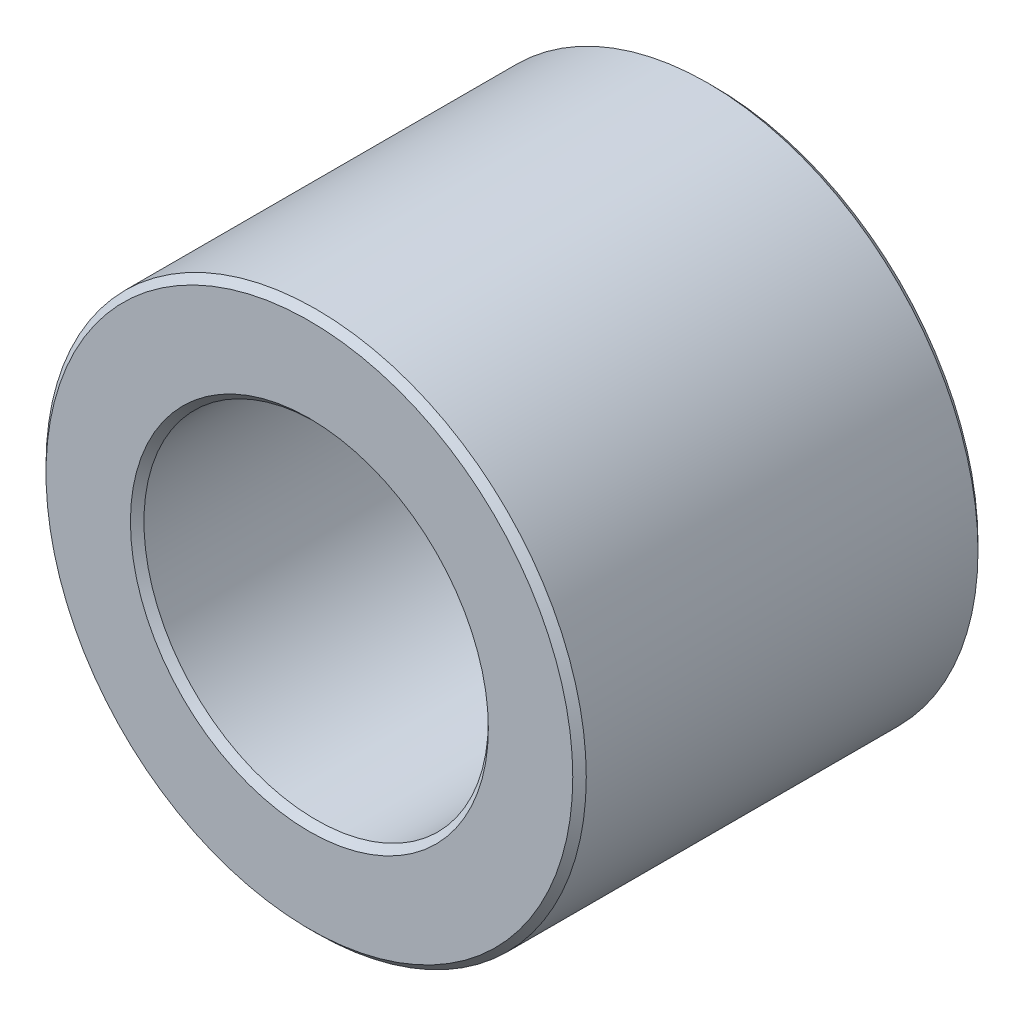
ISO-10303-21;
HEADER;
FILE_DESCRIPTION(('STEP AP214'),'2;1');
FILE_NAME('part.step','',(''),(''),'','','');
FILE_SCHEMA(('AUTOMOTIVE_DESIGN { 1 0 10303 214 1 1 1 1 }'));
ENDSEC;
DATA;
#1=APPLICATION_CONTEXT('core data for automotive mechanical design processes');
#2=APPLICATION_PROTOCOL_DEFINITION('international standard','automotive_design',2000,#1);
#3=PRODUCT_CONTEXT('',#1,'mechanical');
#4=PRODUCT('Part','Part','',(#3));
#5=PRODUCT_RELATED_PRODUCT_CATEGORY('part','',(#4));
#6=PRODUCT_DEFINITION_FORMATION('','',#4);
#7=PRODUCT_DEFINITION_CONTEXT('part definition',#1,'design');
#8=PRODUCT_DEFINITION('design','',#6,#7);
#9=PRODUCT_DEFINITION_SHAPE('','',#8);
#10=(LENGTH_UNIT() NAMED_UNIT(*) SI_UNIT(.MILLI.,.METRE.));
#11=(NAMED_UNIT(*) PLANE_ANGLE_UNIT() SI_UNIT($,.RADIAN.));
#12=(NAMED_UNIT(*) SI_UNIT($,.STERADIAN.) SOLID_ANGLE_UNIT());
#13=UNCERTAINTY_MEASURE_WITH_UNIT(LENGTH_MEASURE(1.E-05),#10,'distance_accuracy_value','');
#14=(GEOMETRIC_REPRESENTATION_CONTEXT(3) GLOBAL_UNCERTAINTY_ASSIGNED_CONTEXT((#13)) GLOBAL_UNIT_ASSIGNED_CONTEXT((#10,
#11,#12)) REPRESENTATION_CONTEXT('',''));
#15=CARTESIAN_POINT('',(0.,0.,0.));
#16=DIRECTION('',(0.,0.,1.));
#17=DIRECTION('',(1.,0.,0.));
#18=AXIS2_PLACEMENT_3D('',#15,#16,#17);
#19=CARTESIAN_POINT('',(0.,0.,6.));
#20=DIRECTION('',(0.,0.,1.));
#21=DIRECTION('',(1.,0.,0.));
#22=AXIS2_PLACEMENT_3D('',#19,#20,#21);
#23=PLANE('',#22);
#24=CARTESIAN_POINT('',(0.,0.,6.));
#25=DIRECTION('',(0.,0.,1.));
#26=DIRECTION('',(1.,0.,0.));
#27=AXIS2_PLACEMENT_3D('',#24,#25,#26);
#28=CIRCLE('',#27,2.65);
#29=CARTESIAN_POINT('',(2.65,0.,6.));
#30=VERTEX_POINT('',#29);
#31=EDGE_CURVE('E10',#30,#30,#28,.F.);
#32=ORIENTED_EDGE('',*,*,#31,.T.);
#33=EDGE_LOOP('',(#32));
#34=FACE_BOUND('',#33,.T.);
#35=CARTESIAN_POINT('',(0.,0.,6.));
#36=DIRECTION('',(0.,0.,1.));
#37=DIRECTION('',(1.,0.,0.));
#38=AXIS2_PLACEMENT_3D('',#35,#36,#37);
#39=CIRCLE('',#38,3.9);
#40=CARTESIAN_POINT('',(3.9,0.,6.));
#41=VERTEX_POINT('',#40);
#42=EDGE_CURVE('E39',#41,#41,#39,.T.);
#43=ORIENTED_EDGE('',*,*,#42,.T.);
#44=EDGE_LOOP('',(#43));
#45=FACE_BOUND('',#44,.T.);
#46=ADVANCED_FACE('F32',(#34,#45),#23,.T.);
#47=CARTESIAN_POINT('',(0.,0.,0.));
#48=DIRECTION('',(0.,0.,1.));
#49=DIRECTION('',(1.,0.,0.));
#50=AXIS2_PLACEMENT_3D('',#47,#48,#49);
#51=PLANE('',#50);
#52=CARTESIAN_POINT('',(0.,0.,0.));
#53=DIRECTION('',(0.,0.,1.));
#54=DIRECTION('',(1.,0.,0.));
#55=AXIS2_PLACEMENT_3D('',#52,#53,#54);
#56=CIRCLE('',#55,2.65);
#57=CARTESIAN_POINT('',(2.65,0.,0.));
#58=VERTEX_POINT('',#57);
#59=EDGE_CURVE('E58',#58,#58,#56,.T.);
#60=ORIENTED_EDGE('',*,*,#59,.T.);
#61=EDGE_LOOP('',(#60));
#62=FACE_BOUND('',#61,.T.);
#63=CARTESIAN_POINT('',(0.,0.,0.));
#64=DIRECTION('',(0.,0.,1.));
#65=DIRECTION('',(1.,0.,0.));
#66=AXIS2_PLACEMENT_3D('',#63,#64,#65);
#67=CIRCLE('',#66,3.9);
#68=CARTESIAN_POINT('',(3.9,0.,0.));
#69=VERTEX_POINT('',#68);
#70=EDGE_CURVE('E61',#69,#69,#67,.F.);
#71=ORIENTED_EDGE('',*,*,#70,.T.);
#72=EDGE_LOOP('',(#71));
#73=FACE_BOUND('',#72,.T.);
#74=ADVANCED_FACE('F65',(#62,#73),#51,.F.);
#75=CARTESIAN_POINT('',(0.,0.,6.));
#76=DIRECTION('',(0.,0.,-1.));
#77=DIRECTION('',(-1.,0.,0.));
#78=AXIS2_PLACEMENT_3D('',#75,#76,#77);
#79=CYLINDRICAL_SURFACE('',#78,4.);
#80=CARTESIAN_POINT('',(0.,0.,0.0999999999999985));
#81=DIRECTION('',(0.,0.,1.));
#82=DIRECTION('',(1.,0.,0.));
#83=AXIS2_PLACEMENT_3D('',#80,#81,#82);
#84=CIRCLE('',#83,4.);
#85=CARTESIAN_POINT('',(4.,0.,0.0999999999999985));
#86=VERTEX_POINT('',#85);
#87=EDGE_CURVE('E43',#86,#86,#84,.T.);
#88=ORIENTED_EDGE('',*,*,#87,.T.);
#89=EDGE_LOOP('',(#88));
#90=FACE_BOUND('',#89,.T.);
#91=CARTESIAN_POINT('',(0.,0.,5.9));
#92=DIRECTION('',(0.,0.,1.));
#93=DIRECTION('',(1.,0.,0.));
#94=AXIS2_PLACEMENT_3D('',#91,#92,#93);
#95=CIRCLE('',#94,4.);
#96=CARTESIAN_POINT('',(4.,0.,5.9));
#97=VERTEX_POINT('',#96);
#98=EDGE_CURVE('E47',#97,#97,#95,.F.);
#99=ORIENTED_EDGE('',*,*,#98,.T.);
#100=EDGE_LOOP('',(#99));
#101=FACE_BOUND('',#100,.T.);
#102=ADVANCED_FACE('F75',(#90,#101),#79,.T.);
#103=CARTESIAN_POINT('',(0.,0.,6.));
#104=DIRECTION('',(0.,0.,-1.));
#105=DIRECTION('',(-1.,0.,0.));
#106=AXIS2_PLACEMENT_3D('',#103,#104,#105);
#107=CYLINDRICAL_SURFACE('',#106,2.55);
#108=CARTESIAN_POINT('',(0.,0.,0.1));
#109=DIRECTION('',(0.,0.,1.));
#110=DIRECTION('',(1.,0.,0.));
#111=AXIS2_PLACEMENT_3D('',#108,#109,#110);
#112=CIRCLE('',#111,2.55);
#113=CARTESIAN_POINT('',(2.55,0.,0.1));
#114=VERTEX_POINT('',#113);
#115=EDGE_CURVE('E52',#114,#114,#112,.F.);
#116=ORIENTED_EDGE('',*,*,#115,.T.);
#117=EDGE_LOOP('',(#116));
#118=FACE_BOUND('',#117,.T.);
#119=CARTESIAN_POINT('',(0.,0.,5.9));
#120=DIRECTION('',(0.,0.,1.));
#121=DIRECTION('',(1.,0.,0.));
#122=AXIS2_PLACEMENT_3D('',#119,#120,#121);
#123=CIRCLE('',#122,2.55);
#124=CARTESIAN_POINT('',(2.55,0.,5.9));
#125=VERTEX_POINT('',#124);
#126=EDGE_CURVE('E55',#125,#125,#123,.T.);
#127=ORIENTED_EDGE('',*,*,#126,.T.);
#128=EDGE_LOOP('',(#127));
#129=FACE_BOUND('',#128,.T.);
#130=ADVANCED_FACE('F78',(#118,#129),#107,.F.);
#131=CARTESIAN_POINT('',(0.,0.,0.));
#132=DIRECTION('',(0.,0.,-1.));
#133=DIRECTION('',(-1.,0.,0.));
#134=AXIS2_PLACEMENT_3D('',#131,#132,#133);
#135=CONICAL_SURFACE('',#134,2.65,0.785398163397446);
#136=ORIENTED_EDGE('',*,*,#115,.F.);
#137=EDGE_LOOP('',(#136));
#138=FACE_BOUND('',#137,.T.);
#139=ORIENTED_EDGE('',*,*,#59,.F.);
#140=EDGE_LOOP('',(#139));
#141=FACE_BOUND('',#140,.T.);
#142=ADVANCED_FACE('F71',(#138,#141),#135,.F.);
#143=CARTESIAN_POINT('',(0.,0.,0.0999999999999985));
#144=DIRECTION('',(0.,0.,1.));
#145=DIRECTION('',(1.,0.,0.));
#146=AXIS2_PLACEMENT_3D('',#143,#144,#145);
#147=CONICAL_SURFACE('',#146,4.,0.785398163397453);
#148=ORIENTED_EDGE('',*,*,#70,.F.);
#149=EDGE_LOOP('',(#148));
#150=FACE_BOUND('',#149,.T.);
#151=ORIENTED_EDGE('',*,*,#87,.F.);
#152=EDGE_LOOP('',(#151));
#153=FACE_BOUND('',#152,.T.);
#154=ADVANCED_FACE('F67',(#150,#153),#147,.T.);
#155=CARTESIAN_POINT('',(0.,0.,5.9));
#156=DIRECTION('',(0.,0.,1.));
#157=DIRECTION('',(1.,0.,0.));
#158=AXIS2_PLACEMENT_3D('',#155,#156,#157);
#159=CONICAL_SURFACE('',#158,2.55,0.78539816339745);
#160=ORIENTED_EDGE('',*,*,#31,.F.);
#161=EDGE_LOOP('',(#160));
#162=FACE_BOUND('',#161,.T.);
#163=ORIENTED_EDGE('',*,*,#126,.F.);
#164=EDGE_LOOP('',(#163));
#165=FACE_BOUND('',#164,.T.);
#166=ADVANCED_FACE('F70',(#162,#165),#159,.F.);
#167=CARTESIAN_POINT('',(0.,0.,6.));
#168=DIRECTION('',(0.,0.,-1.));
#169=DIRECTION('',(-1.,0.,0.));
#170=AXIS2_PLACEMENT_3D('',#167,#168,#169);
#171=CONICAL_SURFACE('',#170,3.9,0.785398163397461);
#172=ORIENTED_EDGE('',*,*,#98,.F.);
#173=EDGE_LOOP('',(#172));
#174=FACE_BOUND('',#173,.T.);
#175=ORIENTED_EDGE('',*,*,#42,.F.);
#176=EDGE_LOOP('',(#175));
#177=FACE_BOUND('',#176,.T.);
#178=ADVANCED_FACE('F34',(#174,#177),#171,.T.);
#179=CLOSED_SHELL('',(#46,#74,#102,#130,#142,#154,#166,#178));
#180=MANIFOLD_SOLID_BREP('B2',#179);
#181=ADVANCED_BREP_SHAPE_REPRESENTATION('',(#18,#180),#14);
#182=SHAPE_DEFINITION_REPRESENTATION(#9,#181);
ENDSEC;
END-ISO-10303-21;
